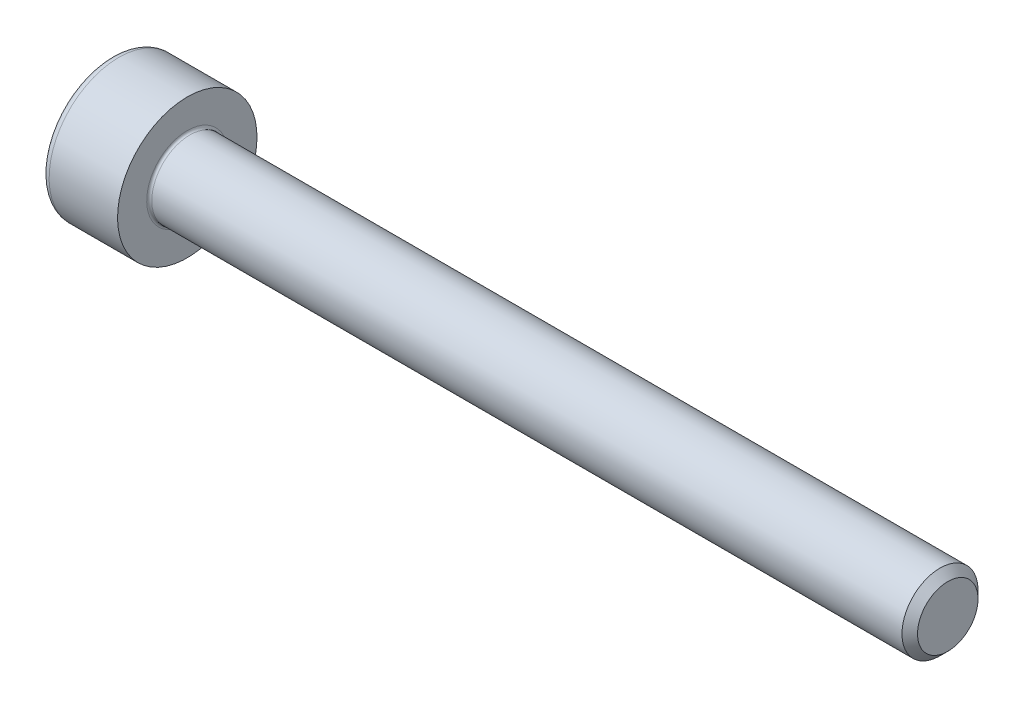
ISO-10303-21;
HEADER;
FILE_DESCRIPTION(('STEP AP214'),'2;1');
FILE_NAME('part.step','',(''),(''),'','','');
FILE_SCHEMA(('AUTOMOTIVE_DESIGN { 1 0 10303 214 1 1 1 1 }'));
ENDSEC;
DATA;
#1=APPLICATION_CONTEXT('core data for automotive mechanical design processes');
#2=APPLICATION_PROTOCOL_DEFINITION('international standard','automotive_design',2000,#1);
#3=PRODUCT_CONTEXT('',#1,'mechanical');
#4=PRODUCT('Part','Part','',(#3));
#5=PRODUCT_RELATED_PRODUCT_CATEGORY('part','',(#4));
#6=PRODUCT_DEFINITION_FORMATION('','',#4);
#7=PRODUCT_DEFINITION_CONTEXT('part definition',#1,'design');
#8=PRODUCT_DEFINITION('design','',#6,#7);
#9=PRODUCT_DEFINITION_SHAPE('','',#8);
#10=(LENGTH_UNIT() NAMED_UNIT(*) SI_UNIT(.MILLI.,.METRE.));
#11=(NAMED_UNIT(*) PLANE_ANGLE_UNIT() SI_UNIT($,.RADIAN.));
#12=(NAMED_UNIT(*) SI_UNIT($,.STERADIAN.) SOLID_ANGLE_UNIT());
#13=UNCERTAINTY_MEASURE_WITH_UNIT(LENGTH_MEASURE(1.E-05),#10,'distance_accuracy_value','');
#14=(GEOMETRIC_REPRESENTATION_CONTEXT(3) GLOBAL_UNCERTAINTY_ASSIGNED_CONTEXT((#13)) GLOBAL_UNIT_ASSIGNED_CONTEXT((#10,
#11,#12)) REPRESENTATION_CONTEXT('',''));
#15=CARTESIAN_POINT('',(0.,0.,0.));
#16=DIRECTION('',(0.,0.,1.));
#17=DIRECTION('',(1.,0.,0.));
#18=AXIS2_PLACEMENT_3D('',#15,#16,#17);
#19=CARTESIAN_POINT('',(0.100000000000002,0.,0.));
#20=DIRECTION('',(-1.,0.,0.));
#21=DIRECTION('',(0.,0.707106781186548,0.707106781186548));
#22=AXIS2_PLACEMENT_3D('',#19,#20,#21);
#23=TOROIDAL_SURFACE('',#22,1.6,0.1);
#24=CARTESIAN_POINT('',(0.,0.,0.));
#25=DIRECTION('',(1.,0.,0.));
#26=DIRECTION('',(0.,-1.,0.));
#27=AXIS2_PLACEMENT_3D('',#24,#25,#26);
#28=CIRCLE('',#27,1.6);
#29=CARTESIAN_POINT('',(0.,1.6,0.));
#30=VERTEX_POINT('',#29);
#31=EDGE_CURVE('E11',#30,#30,#28,.T.);
#32=ORIENTED_EDGE('',*,*,#31,.T.);
#33=EDGE_LOOP('',(#32));
#34=FACE_BOUND('',#33,.T.);
#35=CARTESIAN_POINT('',(0.100000000000002,0.,0.));
#36=DIRECTION('',(-1.,0.,0.));
#37=DIRECTION('',(0.,-1.,0.));
#38=AXIS2_PLACEMENT_3D('',#35,#36,#37);
#39=CIRCLE('',#38,1.5);
#40=CARTESIAN_POINT('',(0.100000000000002,1.5,0.));
#41=VERTEX_POINT('',#40);
#42=EDGE_CURVE('E29',#41,#41,#39,.T.);
#43=ORIENTED_EDGE('',*,*,#42,.T.);
#44=EDGE_LOOP('',(#43));
#45=FACE_BOUND('',#44,.T.);
#46=ADVANCED_FACE('F17',(#34,#45),#23,.F.);
#47=CARTESIAN_POINT('',(21.,0.,0.));
#48=DIRECTION('',(1.,0.,0.));
#49=DIRECTION('',(0.,1.,0.));
#50=AXIS2_PLACEMENT_3D('',#47,#48,#49);
#51=CYLINDRICAL_SURFACE('',#50,1.5);
#52=CARTESIAN_POINT('',(29.693275,0.,0.));
#53=DIRECTION('',(1.,0.,0.));
#54=DIRECTION('',(0.,-1.,0.));
#55=AXIS2_PLACEMENT_3D('',#52,#53,#54);
#56=CIRCLE('',#55,1.5);
#57=CARTESIAN_POINT('',(29.693275,1.5,0.));
#58=VERTEX_POINT('',#57);
#59=EDGE_CURVE('E241',#58,#58,#56,.T.);
#60=ORIENTED_EDGE('',*,*,#59,.F.);
#61=EDGE_LOOP('',(#60));
#62=FACE_BOUND('',#61,.T.);
#63=ORIENTED_EDGE('',*,*,#42,.F.);
#64=EDGE_LOOP('',(#63));
#65=FACE_BOUND('',#64,.T.);
#66=ADVANCED_FACE('F104',(#62,#65),#51,.T.);
#67=CARTESIAN_POINT('',(0.,2.125,0.));
#68=DIRECTION('',(1.,0.,0.));
#69=DIRECTION('',(0.,0.707106781186548,0.707106781186548));
#70=AXIS2_PLACEMENT_3D('',#67,#68,#69);
#71=PLANE('',#70);
#72=CARTESIAN_POINT('',(0.,0.,0.));
#73=DIRECTION('',(1.,0.,0.));
#74=DIRECTION('',(0.,1.,0.));
#75=AXIS2_PLACEMENT_3D('',#72,#73,#74);
#76=CIRCLE('',#75,2.75);
#77=CARTESIAN_POINT('',(0.,2.75,0.));
#78=VERTEX_POINT('',#77);
#79=EDGE_CURVE('E242',#78,#78,#76,.T.);
#80=ORIENTED_EDGE('',*,*,#79,.T.);
#81=EDGE_LOOP('',(#80));
#82=FACE_BOUND('',#81,.T.);
#83=ORIENTED_EDGE('',*,*,#31,.F.);
#84=EDGE_LOOP('',(#83));
#85=FACE_BOUND('',#84,.T.);
#86=ADVANCED_FACE('F110',(#82,#85),#71,.T.);
#87=CARTESIAN_POINT('',(29.8466375,0.,0.));
#88=DIRECTION('',(-1.,0.,0.));
#89=DIRECTION('',(0.,-1.,0.));
#90=AXIS2_PLACEMENT_3D('',#87,#88,#89);
#91=CONICAL_SURFACE('',#90,1.3466375,0.785398163397445);
#92=ORIENTED_EDGE('',*,*,#59,.T.);
#93=EDGE_LOOP('',(#92));
#94=FACE_BOUND('',#93,.T.);
#95=CARTESIAN_POINT('',(30.,0.,0.));
#96=DIRECTION('',(-1.,0.,0.));
#97=DIRECTION('',(0.,-1.,0.));
#98=AXIS2_PLACEMENT_3D('',#95,#96,#97);
#99=CIRCLE('',#98,1.193275);
#100=CARTESIAN_POINT('',(30.,1.193275,0.));
#101=VERTEX_POINT('',#100);
#102=EDGE_CURVE('E238',#101,#101,#99,.T.);
#103=ORIENTED_EDGE('',*,*,#102,.T.);
#104=EDGE_LOOP('',(#103));
#105=FACE_BOUND('',#104,.T.);
#106=ADVANCED_FACE('F117',(#94,#105),#91,.T.);
#107=CARTESIAN_POINT('',(30.,0.75,0.));
#108=DIRECTION('',(1.,0.,0.));
#109=DIRECTION('',(0.,0.707106781186548,0.707106781186548));
#110=AXIS2_PLACEMENT_3D('',#107,#108,#109);
#111=PLANE('',#110);
#112=ORIENTED_EDGE('',*,*,#102,.F.);
#113=EDGE_LOOP('',(#112));
#114=FACE_BOUND('',#113,.T.);
#115=ADVANCED_FACE('F121',(#114),#111,.T.);
#116=CARTESIAN_POINT('',(-2.7,0.,0.));
#117=DIRECTION('',(1.,0.,0.));
#118=DIRECTION('',(0.,0.707106781186548,0.707106781186548));
#119=AXIS2_PLACEMENT_3D('',#116,#117,#118);
#120=TOROIDAL_SURFACE('',#119,2.45,0.3);
#121=CARTESIAN_POINT('',(-3.,0.,0.));
#122=DIRECTION('',(1.,0.,0.));
#123=DIRECTION('',(0.,-1.,0.));
#124=AXIS2_PLACEMENT_3D('',#121,#122,#123);
#125=CIRCLE('',#124,2.45);
#126=CARTESIAN_POINT('',(-3.,2.45,0.));
#127=VERTEX_POINT('',#126);
#128=EDGE_CURVE('E235',#127,#127,#125,.T.);
#129=ORIENTED_EDGE('',*,*,#128,.T.);
#130=EDGE_LOOP('',(#129));
#131=FACE_BOUND('',#130,.T.);
#132=CARTESIAN_POINT('',(-2.7,0.,0.));
#133=DIRECTION('',(-1.,0.,0.));
#134=DIRECTION('',(0.,-1.,0.));
#135=AXIS2_PLACEMENT_3D('',#132,#133,#134);
#136=CIRCLE('',#135,2.75);
#137=CARTESIAN_POINT('',(-2.7,2.75,0.));
#138=VERTEX_POINT('',#137);
#139=EDGE_CURVE('E232',#138,#138,#136,.T.);
#140=ORIENTED_EDGE('',*,*,#139,.T.);
#141=EDGE_LOOP('',(#140));
#142=FACE_BOUND('',#141,.T.);
#143=ADVANCED_FACE('F125',(#131,#142),#120,.T.);
#144=CARTESIAN_POINT('',(-3.,2.09668783648703,0.));
#145=DIRECTION('',(-1.,0.,0.));
#146=DIRECTION('',(0.,0.707106781186548,0.707106781186548));
#147=AXIS2_PLACEMENT_3D('',#144,#145,#146);
#148=PLANE('',#147);
#149=DIRECTION('',(0.,0.,1.));
#150=VECTOR('',#149,1.);
#151=CARTESIAN_POINT('',(-3.,1.25,0.360843918243514));
#152=LINE('',#151,#150);
#153=CARTESIAN_POINT('',(-3.,1.25,-0.721687836487033));
#154=VERTEX_POINT('',#153);
#155=CARTESIAN_POINT('',(-3.,1.25,0.721687836487031));
#156=VERTEX_POINT('',#155);
#157=EDGE_CURVE('E229',#154,#156,#152,.T.);
#158=ORIENTED_EDGE('',*,*,#157,.T.);
#159=DIRECTION('',(0.,-0.866025403784438,0.5));
#160=VECTOR('',#159,1.);
#161=CARTESIAN_POINT('',(-3.,0.3125,1.26295371385231));
#162=LINE('',#161,#160);
#163=CARTESIAN_POINT('',(-3.,0.,1.44337567297406));
#164=VERTEX_POINT('',#163);
#165=EDGE_CURVE('E226',#156,#164,#162,.T.);
#166=ORIENTED_EDGE('',*,*,#165,.T.);
#167=DIRECTION('',(0.,-0.866025403784439,-0.5));
#168=VECTOR('',#167,1.);
#169=CARTESIAN_POINT('',(-3.,-0.9375,0.902109795608791));
#170=LINE('',#169,#168);
#171=CARTESIAN_POINT('',(-3.,-1.25,0.721687836487033));
#172=VERTEX_POINT('',#171);
#173=EDGE_CURVE('E223',#164,#172,#170,.T.);
#174=ORIENTED_EDGE('',*,*,#173,.T.);
#175=DIRECTION('',(0.,0.,-1.));
#176=VECTOR('',#175,1.);
#177=CARTESIAN_POINT('',(-3.,-1.25,-0.360843918243516));
#178=LINE('',#177,#176);
#179=CARTESIAN_POINT('',(-3.,-1.25,-0.721687836487032));
#180=VERTEX_POINT('',#179);
#181=EDGE_CURVE('E220',#172,#180,#178,.T.);
#182=ORIENTED_EDGE('',*,*,#181,.T.);
#183=DIRECTION('',(0.,0.866025403784439,-0.5));
#184=VECTOR('',#183,1.);
#185=CARTESIAN_POINT('',(-3.,-0.3125,-1.26295371385231));
#186=LINE('',#185,#184);
#187=CARTESIAN_POINT('',(-3.,0.,-1.44337567297406));
#188=VERTEX_POINT('',#187);
#189=EDGE_CURVE('E217',#180,#188,#186,.T.);
#190=ORIENTED_EDGE('',*,*,#189,.T.);
#191=DIRECTION('',(0.,0.866025403784439,0.5));
#192=VECTOR('',#191,1.);
#193=CARTESIAN_POINT('',(-3.,0.9375,-0.902109795608791));
#194=LINE('',#193,#192);
#195=EDGE_CURVE('E209',#188,#154,#194,.T.);
#196=ORIENTED_EDGE('',*,*,#195,.T.);
#197=EDGE_LOOP('',(#158,#166,#174,#182,#190,#196));
#198=FACE_BOUND('',#197,.T.);
#199=ORIENTED_EDGE('',*,*,#128,.F.);
#200=EDGE_LOOP('',(#199));
#201=FACE_BOUND('',#200,.T.);
#202=ADVANCED_FACE('F129',(#198,#201),#148,.T.);
#203=CARTESIAN_POINT('',(-1.5,0.,0.));
#204=DIRECTION('',(1.,0.,0.));
#205=DIRECTION('',(0.,1.,0.));
#206=AXIS2_PLACEMENT_3D('',#203,#204,#205);
#207=CYLINDRICAL_SURFACE('',#206,2.75);
#208=ORIENTED_EDGE('',*,*,#79,.F.);
#209=EDGE_LOOP('',(#208));
#210=FACE_BOUND('',#209,.T.);
#211=ORIENTED_EDGE('',*,*,#139,.F.);
#212=EDGE_LOOP('',(#211));
#213=FACE_BOUND('',#212,.T.);
#214=ADVANCED_FACE('F133',(#210,#213),#207,.T.);
#215=CARTESIAN_POINT('',(-3.,0.,-1.44337567297406));
#216=DIRECTION('',(0.,-0.5,-0.866025403784439));
#217=DIRECTION('',(0.447213595499958,-0.774596669241483,0.447213595499958));
#218=AXIS2_PLACEMENT_3D('',#215,#216,#217);
#219=PLANE('',#218);
#220=CARTESIAN_POINT('',(-1.5,0.,-1.44337567297407));
#221=CARTESIAN_POINT('',(-1.29166666666666,-0.625000000000001,-1.08253175473055));
#222=CARTESIAN_POINT('',(-1.5,-1.25000000000001,-0.721687836487024));
#223=(BOUNDED_CURVE() B_SPLINE_CURVE(2,(#220,#221,#222),.UNSPECIFIED.,.F.,
.F.) B_SPLINE_CURVE_WITH_KNOTS((3,3),(0.,0.146054517259743),
.UNSPECIFIED.) CURVE() GEOMETRIC_REPRESENTATION_ITEM() RATIONAL_B_SPLINE_CURVE((1.,
1.15470053837926,1.)) REPRESENTATION_ITEM(''));
#224=CARTESIAN_POINT('',(-1.5,0.,-1.44337567297406));
#225=VERTEX_POINT('',#224);
#226=CARTESIAN_POINT('',(-1.5,-1.25,-0.721687836487032));
#227=VERTEX_POINT('',#226);
#228=EDGE_CURVE('E164',#225,#227,#223,.T.);
#229=ORIENTED_EDGE('',*,*,#228,.F.);
#230=DIRECTION('',(-1.,0.,0.));
#231=VECTOR('',#230,1.);
#232=CARTESIAN_POINT('',(-2.25,0.,-1.44337567297406));
#233=LINE('',#232,#231);
#234=EDGE_CURVE('E200',#225,#188,#233,.T.);
#235=ORIENTED_EDGE('',*,*,#234,.T.);
#236=ORIENTED_EDGE('',*,*,#189,.F.);
#237=DIRECTION('',(-1.,0.,0.));
#238=VECTOR('',#237,1.);
#239=CARTESIAN_POINT('',(-2.25,-1.25,-0.721687836487033));
#240=LINE('',#239,#238);
#241=EDGE_CURVE('E160',#227,#180,#240,.T.);
#242=ORIENTED_EDGE('',*,*,#241,.F.);
#243=EDGE_LOOP('',(#229,#235,#236,#242));
#244=FACE_BOUND('',#243,.T.);
#245=ADVANCED_FACE('F137',(#244),#219,.F.);
#246=CARTESIAN_POINT('',(-3.,1.25,-0.721687836487033));
#247=DIRECTION('',(0.,0.5,-0.866025403784439));
#248=DIRECTION('',(0.654653670707977,0.654653670707977,0.377964473009227));
#249=AXIS2_PLACEMENT_3D('',#246,#247,#248);
#250=PLANE('',#249);
#251=CARTESIAN_POINT('',(-1.5,1.25000000000001,-0.721687836487025));
#252=CARTESIAN_POINT('',(-1.29166666666666,0.625000000000001,-1.08253175473054));
#253=CARTESIAN_POINT('',(-1.5,0.,-1.44337567297407));
#254=(BOUNDED_CURVE() B_SPLINE_CURVE(2,(#251,#252,#253),.UNSPECIFIED.,.F.,
.F.) B_SPLINE_CURVE_WITH_KNOTS((3,3),(0.,0.146054517259743),
.UNSPECIFIED.) CURVE() GEOMETRIC_REPRESENTATION_ITEM() RATIONAL_B_SPLINE_CURVE((1.,
1.15470053837926,1.)) REPRESENTATION_ITEM(''));
#255=CARTESIAN_POINT('',(-1.5,1.25,-0.721687836487035));
#256=VERTEX_POINT('',#255);
#257=EDGE_CURVE('E166',#256,#225,#254,.T.);
#258=ORIENTED_EDGE('',*,*,#257,.F.);
#259=DIRECTION('',(-1.,0.,0.));
#260=VECTOR('',#259,1.);
#261=CARTESIAN_POINT('',(-2.25,1.25,-0.721687836487034));
#262=LINE('',#261,#260);
#263=EDGE_CURVE('E191',#256,#154,#262,.T.);
#264=ORIENTED_EDGE('',*,*,#263,.T.);
#265=ORIENTED_EDGE('',*,*,#195,.F.);
#266=ORIENTED_EDGE('',*,*,#234,.F.);
#267=EDGE_LOOP('',(#258,#264,#265,#266));
#268=FACE_BOUND('',#267,.T.);
#269=ADVANCED_FACE('F141',(#268),#250,.F.);
#270=CARTESIAN_POINT('',(-3.,1.25,0.721687836487031));
#271=DIRECTION('',(0.,1.,0.));
#272=DIRECTION('',(0.707106781186548,0.,0.707106781186548));
#273=AXIS2_PLACEMENT_3D('',#270,#271,#272);
#274=PLANE('',#273);
#275=CARTESIAN_POINT('',(-1.5,1.25,0.721687836487046));
#276=CARTESIAN_POINT('',(-1.29166666666665,1.25,0.));
#277=CARTESIAN_POINT('',(-1.5,1.25,-0.721687836487049));
#278=(BOUNDED_CURVE() B_SPLINE_CURVE(2,(#275,#276,#277),.UNSPECIFIED.,.F.,
.F.) B_SPLINE_CURVE_WITH_KNOTS((3,3),(0.,0.146054517259743),
.UNSPECIFIED.) CURVE() GEOMETRIC_REPRESENTATION_ITEM() RATIONAL_B_SPLINE_CURVE((1.,
1.15470053837925,1.)) REPRESENTATION_ITEM(''));
#279=CARTESIAN_POINT('',(-1.5,1.25,0.72168783648703));
#280=VERTEX_POINT('',#279);
#281=EDGE_CURVE('E181',#280,#256,#278,.T.);
#282=ORIENTED_EDGE('',*,*,#281,.F.);
#283=DIRECTION('',(-1.,0.,0.));
#284=VECTOR('',#283,1.);
#285=CARTESIAN_POINT('',(-2.25,1.25,0.72168783648703));
#286=LINE('',#285,#284);
#287=EDGE_CURVE('E176',#280,#156,#286,.T.);
#288=ORIENTED_EDGE('',*,*,#287,.T.);
#289=ORIENTED_EDGE('',*,*,#157,.F.);
#290=ORIENTED_EDGE('',*,*,#263,.F.);
#291=EDGE_LOOP('',(#282,#288,#289,#290));
#292=FACE_BOUND('',#291,.T.);
#293=ADVANCED_FACE('F145',(#292),#274,.F.);
#294=CARTESIAN_POINT('',(-3.,0.,1.44337567297406));
#295=DIRECTION('',(0.,0.5,0.866025403784438));
#296=DIRECTION('',(0.447213595499959,-0.774596669241483,0.447213595499959));
#297=AXIS2_PLACEMENT_3D('',#294,#295,#296);
#298=PLANE('',#297);
#299=CARTESIAN_POINT('',(-1.5,0.,1.44337567297407));
#300=CARTESIAN_POINT('',(-1.29166666666665,0.625,1.08253175473054));
#301=CARTESIAN_POINT('',(-1.5,1.25000000000001,0.721687836487022));
#302=(BOUNDED_CURVE() B_SPLINE_CURVE(2,(#299,#300,#301),.UNSPECIFIED.,.F.,
.F.) B_SPLINE_CURVE_WITH_KNOTS((3,3),(0.,0.146054517259743),
.UNSPECIFIED.) CURVE() GEOMETRIC_REPRESENTATION_ITEM() RATIONAL_B_SPLINE_CURVE((1.,
1.15470053837926,1.)) REPRESENTATION_ITEM(''));
#303=CARTESIAN_POINT('',(-1.5,0.,1.44337567297406));
#304=VERTEX_POINT('',#303);
#305=EDGE_CURVE('E179',#304,#280,#302,.T.);
#306=ORIENTED_EDGE('',*,*,#305,.F.);
#307=DIRECTION('',(1.,0.,0.));
#308=VECTOR('',#307,1.);
#309=CARTESIAN_POINT('',(-2.25,0.,1.44337567297406));
#310=LINE('',#309,#308);
#311=EDGE_CURVE('E171',#164,#304,#310,.T.);
#312=ORIENTED_EDGE('',*,*,#311,.F.);
#313=ORIENTED_EDGE('',*,*,#165,.F.);
#314=ORIENTED_EDGE('',*,*,#287,.F.);
#315=EDGE_LOOP('',(#306,#312,#313,#314));
#316=FACE_BOUND('',#315,.T.);
#317=ADVANCED_FACE('F149',(#316),#298,.F.);
#318=CARTESIAN_POINT('',(-3.,-1.25,-0.721687836487032));
#319=DIRECTION('',(0.,-1.,0.));
#320=DIRECTION('',(0.707106781186548,0.,0.707106781186548));
#321=AXIS2_PLACEMENT_3D('',#318,#319,#320);
#322=PLANE('',#321);
#323=CARTESIAN_POINT('',(-1.5,-1.25,-0.721687836487048));
#324=CARTESIAN_POINT('',(-1.29166666666666,-1.25,0.));
#325=CARTESIAN_POINT('',(-1.5,-1.25,0.721687836487048));
#326=(BOUNDED_CURVE() B_SPLINE_CURVE(2,(#323,#324,#325),.UNSPECIFIED.,.F.,
.F.) B_SPLINE_CURVE_WITH_KNOTS((3,3),(0.,0.146054517259743),
.UNSPECIFIED.) CURVE() GEOMETRIC_REPRESENTATION_ITEM() RATIONAL_B_SPLINE_CURVE((1.,
1.15470053837926,1.)) REPRESENTATION_ITEM(''));
#327=CARTESIAN_POINT('',(-1.5,-1.25,0.721687836487032));
#328=VERTEX_POINT('',#327);
#329=EDGE_CURVE('E90',#227,#328,#326,.T.);
#330=ORIENTED_EDGE('',*,*,#329,.F.);
#331=ORIENTED_EDGE('',*,*,#241,.T.);
#332=ORIENTED_EDGE('',*,*,#181,.F.);
#333=DIRECTION('',(-1.,0.,0.));
#334=VECTOR('',#333,1.);
#335=CARTESIAN_POINT('',(-2.25,-1.25,0.721687836487032));
#336=LINE('',#335,#334);
#337=EDGE_CURVE('E162',#328,#172,#336,.T.);
#338=ORIENTED_EDGE('',*,*,#337,.F.);
#339=EDGE_LOOP('',(#330,#331,#332,#338));
#340=FACE_BOUND('',#339,.T.);
#341=ADVANCED_FACE('F100',(#340),#322,.F.);
#342=CARTESIAN_POINT('',(-3.,-1.25,0.721687836487033));
#343=DIRECTION('',(0.,-0.5,0.866025403784439));
#344=DIRECTION('',(0.654653670707977,0.654653670707977,0.377964473009227));
#345=AXIS2_PLACEMENT_3D('',#342,#343,#344);
#346=PLANE('',#345);
#347=CARTESIAN_POINT('',(-1.5,-1.25000000000001,0.721687836487025));
#348=CARTESIAN_POINT('',(-1.29166666666666,-0.625000000000001,1.08253175473054));
#349=CARTESIAN_POINT('',(-1.5,0.,1.44337567297407));
#350=(BOUNDED_CURVE() B_SPLINE_CURVE(2,(#347,#348,#349),.UNSPECIFIED.,.F.,
.F.) B_SPLINE_CURVE_WITH_KNOTS((3,3),(0.,0.146054517259743),
.UNSPECIFIED.) CURVE() GEOMETRIC_REPRESENTATION_ITEM() RATIONAL_B_SPLINE_CURVE((1.,
1.15470053837926,1.)) REPRESENTATION_ITEM(''));
#351=EDGE_CURVE('E21',#328,#304,#350,.T.);
#352=ORIENTED_EDGE('',*,*,#351,.F.);
#353=ORIENTED_EDGE('',*,*,#337,.T.);
#354=ORIENTED_EDGE('',*,*,#173,.F.);
#355=ORIENTED_EDGE('',*,*,#311,.T.);
#356=EDGE_LOOP('',(#352,#353,#354,#355));
#357=FACE_BOUND('',#356,.T.);
#358=ADVANCED_FACE('F95',(#357),#346,.F.);
#359=CARTESIAN_POINT('',(-1.08333333333332,0.,0.));
#360=DIRECTION('',(-1.,0.,0.));
#361=DIRECTION('',(0.,1.,0.));
#362=AXIS2_PLACEMENT_3D('',#359,#360,#361);
#363=CONICAL_SURFACE('',#362,0.721687836487032,1.0471975511966);
#364=ORIENTED_EDGE('',*,*,#305,.T.);
#365=ORIENTED_EDGE('',*,*,#281,.T.);
#366=ORIENTED_EDGE('',*,*,#257,.T.);
#367=ORIENTED_EDGE('',*,*,#228,.T.);
#368=ORIENTED_EDGE('',*,*,#329,.T.);
#369=ORIENTED_EDGE('',*,*,#351,.T.);
#370=EDGE_LOOP('',(#364,#365,#366,#367,#368,#369));
#371=FACE_BOUND('',#370,.T.);
#372=CARTESIAN_POINT('',(-0.66666666666666,0.,0.));
#373=VERTEX_POINT('',#372);
#374=VERTEX_LOOP('',#373);
#375=FACE_BOUND('',#374,.T.);
#376=ADVANCED_FACE('F19',(#371,#375),#363,.F.);
#377=CLOSED_SHELL('',(#46,#66,#86,#106,#115,#143,#202,#214,#245,#269,#293,#317,#341,#358,#376));
#378=MANIFOLD_SOLID_BREP('B1',#377);
#379=ADVANCED_BREP_SHAPE_REPRESENTATION('',(#18,#378),#14);
#380=SHAPE_DEFINITION_REPRESENTATION(#9,#379);
ENDSEC;
END-ISO-10303-21;
